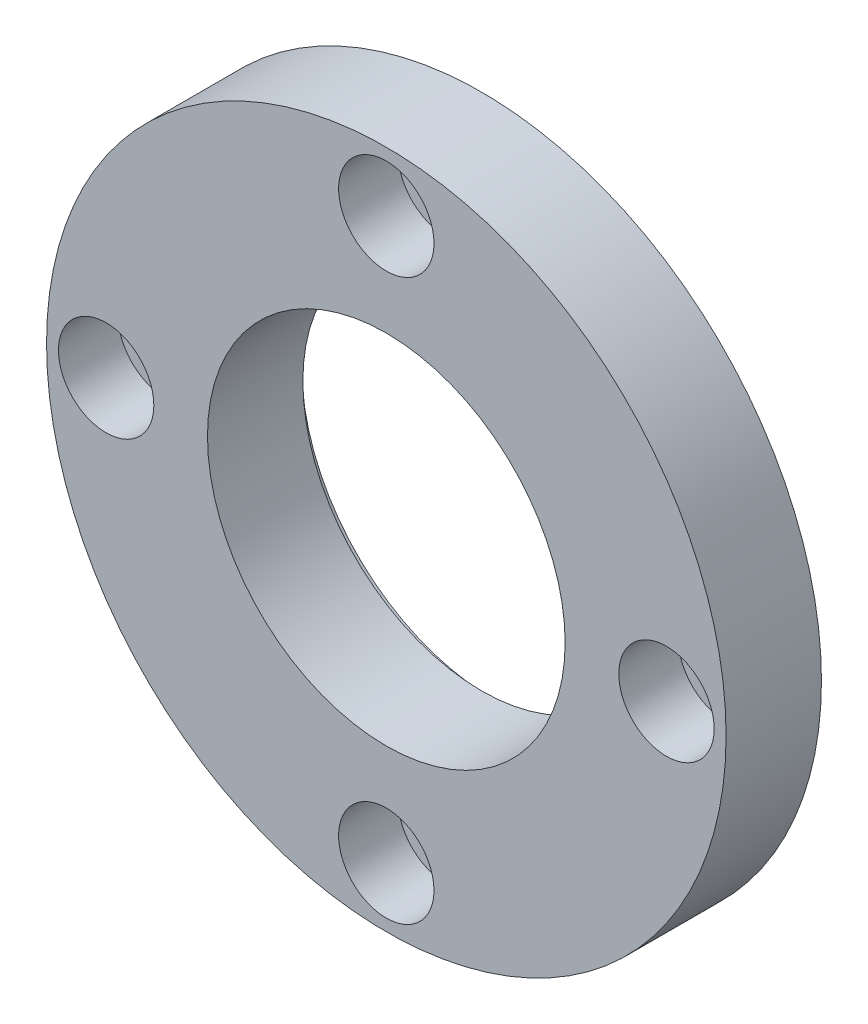
ISO-10303-21;
HEADER;
FILE_DESCRIPTION(('STEP AP214'),'2;1');
FILE_NAME('part.step','',(''),(''),'','','');
FILE_SCHEMA(('AUTOMOTIVE_DESIGN { 1 0 10303 214 1 1 1 1 }'));
ENDSEC;
DATA;
#1=APPLICATION_CONTEXT('core data for automotive mechanical design processes');
#2=APPLICATION_PROTOCOL_DEFINITION('international standard','automotive_design',2000,#1);
#3=PRODUCT_CONTEXT('',#1,'mechanical');
#4=PRODUCT('Part','Part','',(#3));
#5=PRODUCT_RELATED_PRODUCT_CATEGORY('part','',(#4));
#6=PRODUCT_DEFINITION_FORMATION('','',#4);
#7=PRODUCT_DEFINITION_CONTEXT('part definition',#1,'design');
#8=PRODUCT_DEFINITION('design','',#6,#7);
#9=PRODUCT_DEFINITION_SHAPE('','',#8);
#10=(LENGTH_UNIT() NAMED_UNIT(*) SI_UNIT(.MILLI.,.METRE.));
#11=(NAMED_UNIT(*) PLANE_ANGLE_UNIT() SI_UNIT($,.RADIAN.));
#12=(NAMED_UNIT(*) SI_UNIT($,.STERADIAN.) SOLID_ANGLE_UNIT());
#13=UNCERTAINTY_MEASURE_WITH_UNIT(LENGTH_MEASURE(1.E-05),#10,'distance_accuracy_value','');
#14=(GEOMETRIC_REPRESENTATION_CONTEXT(3) GLOBAL_UNCERTAINTY_ASSIGNED_CONTEXT((#13)) GLOBAL_UNIT_ASSIGNED_CONTEXT((#10,
#11,#12)) REPRESENTATION_CONTEXT('',''));
#15=CARTESIAN_POINT('',(0.,0.,0.));
#16=DIRECTION('',(0.,0.,1.));
#17=DIRECTION('',(1.,0.,0.));
#18=AXIS2_PLACEMENT_3D('',#15,#16,#17);
#19=CARTESIAN_POINT('',(0.,0.,0.));
#20=DIRECTION('',(0.,0.,1.));
#21=DIRECTION('',(1.,0.,0.));
#22=AXIS2_PLACEMENT_3D('',#19,#20,#21);
#23=PLANE('',#22);
#24=CARTESIAN_POINT('',(0.,-23.5,0.));
#25=DIRECTION('',(0.,0.,1.));
#26=DIRECTION('',(1.,0.,0.));
#27=AXIS2_PLACEMENT_3D('',#24,#25,#26);
#28=CIRCLE('',#27,2.25);
#29=CARTESIAN_POINT('',(2.25,-23.5,0.));
#30=VERTEX_POINT('',#29);
#31=EDGE_CURVE('E58',#30,#30,#28,.T.);
#32=ORIENTED_EDGE('',*,*,#31,.T.);
#33=EDGE_LOOP('',(#32));
#34=FACE_BOUND('',#33,.T.);
#35=CARTESIAN_POINT('',(23.5,0.,0.));
#36=DIRECTION('',(0.,0.,1.));
#37=DIRECTION('',(1.,0.,0.));
#38=AXIS2_PLACEMENT_3D('',#35,#36,#37);
#39=CIRCLE('',#38,2.25);
#40=CARTESIAN_POINT('',(25.75,0.,0.));
#41=VERTEX_POINT('',#40);
#42=EDGE_CURVE('E55',#41,#41,#39,.T.);
#43=ORIENTED_EDGE('',*,*,#42,.T.);
#44=EDGE_LOOP('',(#43));
#45=FACE_BOUND('',#44,.T.);
#46=CARTESIAN_POINT('',(0.,23.5,0.));
#47=DIRECTION('',(0.,0.,1.));
#48=DIRECTION('',(1.,0.,0.));
#49=AXIS2_PLACEMENT_3D('',#46,#47,#48);
#50=CIRCLE('',#49,2.25);
#51=CARTESIAN_POINT('',(2.25,23.5,0.));
#52=VERTEX_POINT('',#51);
#53=EDGE_CURVE('E52',#52,#52,#50,.T.);
#54=ORIENTED_EDGE('',*,*,#53,.T.);
#55=EDGE_LOOP('',(#54));
#56=FACE_BOUND('',#55,.T.);
#57=CARTESIAN_POINT('',(-23.5,0.,0.));
#58=DIRECTION('',(0.,0.,1.));
#59=DIRECTION('',(1.,0.,0.));
#60=AXIS2_PLACEMENT_3D('',#57,#58,#59);
#61=CIRCLE('',#60,2.25);
#62=CARTESIAN_POINT('',(-21.25,0.,0.));
#63=VERTEX_POINT('',#62);
#64=EDGE_CURVE('E51',#63,#63,#61,.T.);
#65=ORIENTED_EDGE('',*,*,#64,.T.);
#66=EDGE_LOOP('',(#65));
#67=FACE_BOUND('',#66,.T.);
#68=CARTESIAN_POINT('',(0.,0.,0.));
#69=DIRECTION('',(0.,0.,1.));
#70=DIRECTION('',(1.,0.,0.));
#71=AXIS2_PLACEMENT_3D('',#68,#69,#70);
#72=CIRCLE('',#71,28.5);
#73=CARTESIAN_POINT('',(28.5,0.,0.));
#74=VERTEX_POINT('',#73);
#75=EDGE_CURVE('E44',#74,#74,#72,.T.);
#76=ORIENTED_EDGE('',*,*,#75,.F.);
#77=EDGE_LOOP('',(#76));
#78=FACE_BOUND('',#77,.T.);
#79=CARTESIAN_POINT('',(0.,0.,0.));
#80=DIRECTION('',(0.,0.,1.));
#81=DIRECTION('',(1.,0.,0.));
#82=AXIS2_PLACEMENT_3D('',#79,#80,#81);
#83=CIRCLE('',#82,18.4);
#84=CARTESIAN_POINT('',(18.4,0.,0.));
#85=VERTEX_POINT('',#84);
#86=EDGE_CURVE('E10',#85,#85,#83,.F.);
#87=ORIENTED_EDGE('',*,*,#86,.F.);
#88=EDGE_LOOP('',(#87));
#89=FACE_BOUND('',#88,.T.);
#90=ADVANCED_FACE('F31',(#34,#45,#56,#67,#78,#89),#23,.F.);
#91=CARTESIAN_POINT('',(0.,0.,8.));
#92=DIRECTION('',(0.,0.,1.));
#93=DIRECTION('',(1.,0.,0.));
#94=AXIS2_PLACEMENT_3D('',#91,#92,#93);
#95=PLANE('',#94);
#96=CARTESIAN_POINT('',(23.5,0.,8.));
#97=DIRECTION('',(0.,0.,1.));
#98=DIRECTION('',(1.,0.,0.));
#99=AXIS2_PLACEMENT_3D('',#96,#97,#98);
#100=CIRCLE('',#99,4.);
#101=CARTESIAN_POINT('',(27.5,0.,8.));
#102=VERTEX_POINT('',#101);
#103=EDGE_CURVE('E73',#102,#102,#100,.T.);
#104=ORIENTED_EDGE('',*,*,#103,.F.);
#105=EDGE_LOOP('',(#104));
#106=FACE_BOUND('',#105,.T.);
#107=CARTESIAN_POINT('',(0.,-23.5,8.));
#108=DIRECTION('',(0.,0.,1.));
#109=DIRECTION('',(1.,0.,0.));
#110=AXIS2_PLACEMENT_3D('',#107,#108,#109);
#111=CIRCLE('',#110,4.);
#112=CARTESIAN_POINT('',(4.,-23.5,8.));
#113=VERTEX_POINT('',#112);
#114=EDGE_CURVE('E79',#113,#113,#111,.T.);
#115=ORIENTED_EDGE('',*,*,#114,.F.);
#116=EDGE_LOOP('',(#115));
#117=FACE_BOUND('',#116,.T.);
#118=CARTESIAN_POINT('',(-23.5,0.,8.));
#119=DIRECTION('',(0.,0.,1.));
#120=DIRECTION('',(1.,0.,0.));
#121=AXIS2_PLACEMENT_3D('',#118,#119,#120);
#122=CIRCLE('',#121,4.);
#123=CARTESIAN_POINT('',(-19.5,0.,8.));
#124=VERTEX_POINT('',#123);
#125=EDGE_CURVE('E85',#124,#124,#122,.T.);
#126=ORIENTED_EDGE('',*,*,#125,.F.);
#127=EDGE_LOOP('',(#126));
#128=FACE_BOUND('',#127,.T.);
#129=CARTESIAN_POINT('',(0.,23.5,8.));
#130=DIRECTION('',(0.,0.,1.));
#131=DIRECTION('',(1.,0.,0.));
#132=AXIS2_PLACEMENT_3D('',#129,#130,#131);
#133=CIRCLE('',#132,4.);
#134=CARTESIAN_POINT('',(4.,23.5,8.));
#135=VERTEX_POINT('',#134);
#136=EDGE_CURVE('E91',#135,#135,#133,.T.);
#137=ORIENTED_EDGE('',*,*,#136,.F.);
#138=EDGE_LOOP('',(#137));
#139=FACE_BOUND('',#138,.T.);
#140=CARTESIAN_POINT('',(0.,0.,8.));
#141=DIRECTION('',(0.,0.,1.));
#142=DIRECTION('',(1.,0.,0.));
#143=AXIS2_PLACEMENT_3D('',#140,#141,#142);
#144=CIRCLE('',#143,28.5);
#145=CARTESIAN_POINT('',(28.5,0.,8.));
#146=VERTEX_POINT('',#145);
#147=EDGE_CURVE('E39',#146,#146,#144,.T.);
#148=ORIENTED_EDGE('',*,*,#147,.T.);
#149=EDGE_LOOP('',(#148));
#150=FACE_BOUND('',#149,.T.);
#151=CARTESIAN_POINT('',(0.,0.,8.));
#152=DIRECTION('',(0.,0.,1.));
#153=DIRECTION('',(1.,0.,0.));
#154=AXIS2_PLACEMENT_3D('',#151,#152,#153);
#155=CIRCLE('',#154,15.);
#156=CARTESIAN_POINT('',(15.,0.,8.));
#157=VERTEX_POINT('',#156);
#158=EDGE_CURVE('E109',#157,#157,#155,.T.);
#159=ORIENTED_EDGE('',*,*,#158,.F.);
#160=EDGE_LOOP('',(#159));
#161=FACE_BOUND('',#160,.T.);
#162=ADVANCED_FACE('F117',(#106,#117,#128,#139,#150,#161),#95,.T.);
#163=CARTESIAN_POINT('',(0.,0.,0.));
#164=DIRECTION('',(0.,0.,-1.));
#165=DIRECTION('',(-1.,0.,0.));
#166=AXIS2_PLACEMENT_3D('',#163,#164,#165);
#167=CIRCLE('',#166,16.1);
#168=CARTESIAN_POINT('',(-16.1,0.,0.));
#169=VERTEX_POINT('',#168);
#170=EDGE_CURVE('E97',#169,#169,#167,.T.);
#171=ORIENTED_EDGE('',*,*,#170,.T.);
#172=EDGE_LOOP('',(#171));
#173=FACE_BOUND('',#172,.T.);
#174=CARTESIAN_POINT('',(0.,0.,0.));
#175=DIRECTION('',(0.,0.,1.));
#176=DIRECTION('',(1.,0.,0.));
#177=AXIS2_PLACEMENT_3D('',#174,#175,#176);
#178=CIRCLE('',#177,15.);
#179=CARTESIAN_POINT('',(15.,0.,0.));
#180=VERTEX_POINT('',#179);
#181=EDGE_CURVE('E106',#180,#180,#178,.T.);
#182=ORIENTED_EDGE('',*,*,#181,.T.);
#183=EDGE_LOOP('',(#182));
#184=FACE_BOUND('',#183,.T.);
#185=ADVANCED_FACE('F119',(#173,#184),#23,.F.);
#186=CARTESIAN_POINT('',(0.,0.,8.));
#187=DIRECTION('',(0.,0.,-1.));
#188=DIRECTION('',(-1.,0.,0.));
#189=AXIS2_PLACEMENT_3D('',#186,#187,#188);
#190=CYLINDRICAL_SURFACE('',#189,28.5);
#191=ORIENTED_EDGE('',*,*,#147,.F.);
#192=EDGE_LOOP('',(#191));
#193=FACE_BOUND('',#192,.T.);
#194=ORIENTED_EDGE('',*,*,#75,.T.);
#195=EDGE_LOOP('',(#194));
#196=FACE_BOUND('',#195,.T.);
#197=ADVANCED_FACE('F33',(#193,#196),#190,.T.);
#198=CARTESIAN_POINT('',(0.,0.,8.));
#199=DIRECTION('',(0.,0.,-1.));
#200=DIRECTION('',(-1.,0.,0.));
#201=AXIS2_PLACEMENT_3D('',#198,#199,#200);
#202=CYLINDRICAL_SURFACE('',#201,15.);
#203=ORIENTED_EDGE('',*,*,#158,.T.);
#204=EDGE_LOOP('',(#203));
#205=FACE_BOUND('',#204,.T.);
#206=ORIENTED_EDGE('',*,*,#181,.F.);
#207=EDGE_LOOP('',(#206));
#208=FACE_BOUND('',#207,.T.);
#209=ADVANCED_FACE('F131',(#205,#208),#202,.F.);
#210=CARTESIAN_POINT('',(0.,0.,-1.));
#211=DIRECTION('',(0.,0.,-1.));
#212=DIRECTION('',(-1.,0.,0.));
#213=AXIS2_PLACEMENT_3D('',#210,#211,#212);
#214=PLANE('',#213);
#215=CARTESIAN_POINT('',(0.,0.,-1.));
#216=DIRECTION('',(0.,0.,-1.));
#217=DIRECTION('',(-1.,0.,0.));
#218=AXIS2_PLACEMENT_3D('',#215,#216,#217);
#219=CIRCLE('',#218,18.4);
#220=CARTESIAN_POINT('',(-18.4,0.,-1.));
#221=VERTEX_POINT('',#220);
#222=EDGE_CURVE('E103',#221,#221,#219,.T.);
#223=ORIENTED_EDGE('',*,*,#222,.T.);
#224=EDGE_LOOP('',(#223));
#225=FACE_BOUND('',#224,.T.);
#226=CARTESIAN_POINT('',(0.,0.,-1.));
#227=DIRECTION('',(0.,0.,-1.));
#228=DIRECTION('',(-1.,0.,0.));
#229=AXIS2_PLACEMENT_3D('',#226,#227,#228);
#230=CIRCLE('',#229,16.1);
#231=CARTESIAN_POINT('',(-16.1,0.,-1.));
#232=VERTEX_POINT('',#231);
#233=EDGE_CURVE('E100',#232,#232,#230,.T.);
#234=ORIENTED_EDGE('',*,*,#233,.F.);
#235=EDGE_LOOP('',(#234));
#236=FACE_BOUND('',#235,.T.);
#237=ADVANCED_FACE('F138',(#225,#236),#214,.T.);
#238=CARTESIAN_POINT('',(0.,0.,-1.));
#239=DIRECTION('',(0.,0.,1.));
#240=DIRECTION('',(1.,0.,0.));
#241=AXIS2_PLACEMENT_3D('',#238,#239,#240);
#242=CYLINDRICAL_SURFACE('',#241,18.4);
#243=ORIENTED_EDGE('',*,*,#222,.F.);
#244=EDGE_LOOP('',(#243));
#245=FACE_BOUND('',#244,.T.);
#246=ORIENTED_EDGE('',*,*,#86,.T.);
#247=EDGE_LOOP('',(#246));
#248=FACE_BOUND('',#247,.T.);
#249=ADVANCED_FACE('F143',(#245,#248),#242,.T.);
#250=CARTESIAN_POINT('',(0.,0.,-1.));
#251=DIRECTION('',(0.,0.,1.));
#252=DIRECTION('',(1.,0.,0.));
#253=AXIS2_PLACEMENT_3D('',#250,#251,#252);
#254=CYLINDRICAL_SURFACE('',#253,16.1);
#255=ORIENTED_EDGE('',*,*,#233,.T.);
#256=EDGE_LOOP('',(#255));
#257=FACE_BOUND('',#256,.T.);
#258=ORIENTED_EDGE('',*,*,#170,.F.);
#259=EDGE_LOOP('',(#258));
#260=FACE_BOUND('',#259,.T.);
#261=ADVANCED_FACE('F148',(#257,#260),#254,.F.);
#262=CARTESIAN_POINT('',(0.,23.5,3.));
#263=DIRECTION('',(0.,0.,1.));
#264=DIRECTION('',(1.,0.,0.));
#265=AXIS2_PLACEMENT_3D('',#262,#263,#264);
#266=CYLINDRICAL_SURFACE('',#265,4.);
#267=CARTESIAN_POINT('',(0.,23.5,3.));
#268=DIRECTION('',(0.,0.,1.));
#269=DIRECTION('',(1.,0.,0.));
#270=AXIS2_PLACEMENT_3D('',#267,#268,#269);
#271=CIRCLE('',#270,4.);
#272=CARTESIAN_POINT('',(4.,23.5,3.));
#273=VERTEX_POINT('',#272);
#274=EDGE_CURVE('E94',#273,#273,#271,.T.);
#275=ORIENTED_EDGE('',*,*,#274,.F.);
#276=EDGE_LOOP('',(#275));
#277=FACE_BOUND('',#276,.T.);
#278=ORIENTED_EDGE('',*,*,#136,.T.);
#279=EDGE_LOOP('',(#278));
#280=FACE_BOUND('',#279,.T.);
#281=ADVANCED_FACE('F153',(#277,#280),#266,.F.);
#282=CARTESIAN_POINT('',(0.,23.5,3.));
#283=DIRECTION('',(0.,0.,1.));
#284=DIRECTION('',(1.,0.,0.));
#285=AXIS2_PLACEMENT_3D('',#282,#283,#284);
#286=PLANE('',#285);
#287=CARTESIAN_POINT('',(0.,23.5,3.));
#288=DIRECTION('',(0.,0.,1.));
#289=DIRECTION('',(1.,0.,0.));
#290=AXIS2_PLACEMENT_3D('',#287,#288,#289);
#291=CIRCLE('',#290,2.25);
#292=CARTESIAN_POINT('',(2.25,23.5,3.));
#293=VERTEX_POINT('',#292);
#294=EDGE_CURVE('E53',#293,#293,#291,.T.);
#295=ORIENTED_EDGE('',*,*,#294,.F.);
#296=EDGE_LOOP('',(#295));
#297=FACE_BOUND('',#296,.T.);
#298=ORIENTED_EDGE('',*,*,#274,.T.);
#299=EDGE_LOOP('',(#298));
#300=FACE_BOUND('',#299,.T.);
#301=ADVANCED_FACE('F157',(#297,#300),#286,.T.);
#302=CARTESIAN_POINT('',(-23.5,0.,3.));
#303=DIRECTION('',(0.,0.,1.));
#304=DIRECTION('',(1.,0.,0.));
#305=AXIS2_PLACEMENT_3D('',#302,#303,#304);
#306=CYLINDRICAL_SURFACE('',#305,4.);
#307=CARTESIAN_POINT('',(-23.5,0.,3.));
#308=DIRECTION('',(0.,0.,1.));
#309=DIRECTION('',(1.,0.,0.));
#310=AXIS2_PLACEMENT_3D('',#307,#308,#309);
#311=CIRCLE('',#310,4.);
#312=CARTESIAN_POINT('',(-19.5,0.,3.));
#313=VERTEX_POINT('',#312);
#314=EDGE_CURVE('E88',#313,#313,#311,.T.);
#315=ORIENTED_EDGE('',*,*,#314,.F.);
#316=EDGE_LOOP('',(#315));
#317=FACE_BOUND('',#316,.T.);
#318=ORIENTED_EDGE('',*,*,#125,.T.);
#319=EDGE_LOOP('',(#318));
#320=FACE_BOUND('',#319,.T.);
#321=ADVANCED_FACE('F161',(#317,#320),#306,.F.);
#322=CARTESIAN_POINT('',(-23.5,0.,3.));
#323=DIRECTION('',(0.,0.,1.));
#324=DIRECTION('',(1.,0.,0.));
#325=AXIS2_PLACEMENT_3D('',#322,#323,#324);
#326=PLANE('',#325);
#327=CARTESIAN_POINT('',(-23.5,0.,3.));
#328=DIRECTION('',(0.,0.,1.));
#329=DIRECTION('',(1.,0.,0.));
#330=AXIS2_PLACEMENT_3D('',#327,#328,#329);
#331=CIRCLE('',#330,2.25);
#332=CARTESIAN_POINT('',(-21.25,0.,3.));
#333=VERTEX_POINT('',#332);
#334=EDGE_CURVE('E48',#333,#333,#331,.T.);
#335=ORIENTED_EDGE('',*,*,#334,.F.);
#336=EDGE_LOOP('',(#335));
#337=FACE_BOUND('',#336,.T.);
#338=ORIENTED_EDGE('',*,*,#314,.T.);
#339=EDGE_LOOP('',(#338));
#340=FACE_BOUND('',#339,.T.);
#341=ADVANCED_FACE('F165',(#337,#340),#326,.T.);
#342=CARTESIAN_POINT('',(0.,-23.5,3.));
#343=DIRECTION('',(0.,0.,1.));
#344=DIRECTION('',(1.,0.,0.));
#345=AXIS2_PLACEMENT_3D('',#342,#343,#344);
#346=CYLINDRICAL_SURFACE('',#345,4.);
#347=CARTESIAN_POINT('',(0.,-23.5,3.));
#348=DIRECTION('',(0.,0.,1.));
#349=DIRECTION('',(1.,0.,0.));
#350=AXIS2_PLACEMENT_3D('',#347,#348,#349);
#351=CIRCLE('',#350,4.);
#352=CARTESIAN_POINT('',(4.,-23.5,3.));
#353=VERTEX_POINT('',#352);
#354=EDGE_CURVE('E82',#353,#353,#351,.T.);
#355=ORIENTED_EDGE('',*,*,#354,.F.);
#356=EDGE_LOOP('',(#355));
#357=FACE_BOUND('',#356,.T.);
#358=ORIENTED_EDGE('',*,*,#114,.T.);
#359=EDGE_LOOP('',(#358));
#360=FACE_BOUND('',#359,.T.);
#361=ADVANCED_FACE('F169',(#357,#360),#346,.F.);
#362=CARTESIAN_POINT('',(0.,-23.5,3.));
#363=DIRECTION('',(0.,0.,1.));
#364=DIRECTION('',(1.,0.,0.));
#365=AXIS2_PLACEMENT_3D('',#362,#363,#364);
#366=PLANE('',#365);
#367=CARTESIAN_POINT('',(0.,-23.5,3.));
#368=DIRECTION('',(0.,0.,1.));
#369=DIRECTION('',(1.,0.,0.));
#370=AXIS2_PLACEMENT_3D('',#367,#368,#369);
#371=CIRCLE('',#370,2.25);
#372=CARTESIAN_POINT('',(2.25,-23.5,3.));
#373=VERTEX_POINT('',#372);
#374=EDGE_CURVE('E35',#373,#373,#371,.T.);
#375=ORIENTED_EDGE('',*,*,#374,.F.);
#376=EDGE_LOOP('',(#375));
#377=FACE_BOUND('',#376,.T.);
#378=ORIENTED_EDGE('',*,*,#354,.T.);
#379=EDGE_LOOP('',(#378));
#380=FACE_BOUND('',#379,.T.);
#381=ADVANCED_FACE('F173',(#377,#380),#366,.T.);
#382=CARTESIAN_POINT('',(23.5,0.,3.));
#383=DIRECTION('',(0.,0.,1.));
#384=DIRECTION('',(1.,0.,0.));
#385=AXIS2_PLACEMENT_3D('',#382,#383,#384);
#386=CYLINDRICAL_SURFACE('',#385,4.);
#387=CARTESIAN_POINT('',(23.5,0.,3.));
#388=DIRECTION('',(0.,0.,1.));
#389=DIRECTION('',(1.,0.,0.));
#390=AXIS2_PLACEMENT_3D('',#387,#388,#389);
#391=CIRCLE('',#390,4.);
#392=CARTESIAN_POINT('',(27.5,0.,3.));
#393=VERTEX_POINT('',#392);
#394=EDGE_CURVE('E76',#393,#393,#391,.T.);
#395=ORIENTED_EDGE('',*,*,#394,.F.);
#396=EDGE_LOOP('',(#395));
#397=FACE_BOUND('',#396,.T.);
#398=ORIENTED_EDGE('',*,*,#103,.T.);
#399=EDGE_LOOP('',(#398));
#400=FACE_BOUND('',#399,.T.);
#401=ADVANCED_FACE('F177',(#397,#400),#386,.F.);
#402=CARTESIAN_POINT('',(23.5,0.,3.));
#403=DIRECTION('',(0.,0.,1.));
#404=DIRECTION('',(1.,0.,0.));
#405=AXIS2_PLACEMENT_3D('',#402,#403,#404);
#406=PLANE('',#405);
#407=CARTESIAN_POINT('',(23.5,0.,3.));
#408=DIRECTION('',(0.,0.,1.));
#409=DIRECTION('',(1.,0.,0.));
#410=AXIS2_PLACEMENT_3D('',#407,#408,#409);
#411=CIRCLE('',#410,2.25);
#412=CARTESIAN_POINT('',(25.75,0.,3.));
#413=VERTEX_POINT('',#412);
#414=EDGE_CURVE('E56',#413,#413,#411,.T.);
#415=ORIENTED_EDGE('',*,*,#414,.F.);
#416=EDGE_LOOP('',(#415));
#417=FACE_BOUND('',#416,.T.);
#418=ORIENTED_EDGE('',*,*,#394,.T.);
#419=EDGE_LOOP('',(#418));
#420=FACE_BOUND('',#419,.T.);
#421=ADVANCED_FACE('F181',(#417,#420),#406,.T.);
#422=CARTESIAN_POINT('',(-23.5,0.,-1.));
#423=DIRECTION('',(0.,0.,1.));
#424=DIRECTION('',(1.,0.,0.));
#425=AXIS2_PLACEMENT_3D('',#422,#423,#424);
#426=CYLINDRICAL_SURFACE('',#425,2.25);
#427=ORIENTED_EDGE('',*,*,#334,.T.);
#428=EDGE_LOOP('',(#427));
#429=FACE_BOUND('',#428,.T.);
#430=ORIENTED_EDGE('',*,*,#64,.F.);
#431=EDGE_LOOP('',(#430));
#432=FACE_BOUND('',#431,.T.);
#433=ADVANCED_FACE('F185',(#429,#432),#426,.F.);
#434=CARTESIAN_POINT('',(0.,23.5,-1.));
#435=DIRECTION('',(0.,0.,1.));
#436=DIRECTION('',(1.,0.,0.));
#437=AXIS2_PLACEMENT_3D('',#434,#435,#436);
#438=CYLINDRICAL_SURFACE('',#437,2.25);
#439=ORIENTED_EDGE('',*,*,#294,.T.);
#440=EDGE_LOOP('',(#439));
#441=FACE_BOUND('',#440,.T.);
#442=ORIENTED_EDGE('',*,*,#53,.F.);
#443=EDGE_LOOP('',(#442));
#444=FACE_BOUND('',#443,.T.);
#445=ADVANCED_FACE('F189',(#441,#444),#438,.F.);
#446=CARTESIAN_POINT('',(23.5,0.,-1.));
#447=DIRECTION('',(0.,0.,1.));
#448=DIRECTION('',(1.,0.,0.));
#449=AXIS2_PLACEMENT_3D('',#446,#447,#448);
#450=CYLINDRICAL_SURFACE('',#449,2.25);
#451=ORIENTED_EDGE('',*,*,#414,.T.);
#452=EDGE_LOOP('',(#451));
#453=FACE_BOUND('',#452,.T.);
#454=ORIENTED_EDGE('',*,*,#42,.F.);
#455=EDGE_LOOP('',(#454));
#456=FACE_BOUND('',#455,.T.);
#457=ADVANCED_FACE('F193',(#453,#456),#450,.F.);
#458=CARTESIAN_POINT('',(0.,-23.5,-1.));
#459=DIRECTION('',(0.,0.,1.));
#460=DIRECTION('',(1.,0.,0.));
#461=AXIS2_PLACEMENT_3D('',#458,#459,#460);
#462=CYLINDRICAL_SURFACE('',#461,2.25);
#463=ORIENTED_EDGE('',*,*,#374,.T.);
#464=EDGE_LOOP('',(#463));
#465=FACE_BOUND('',#464,.T.);
#466=ORIENTED_EDGE('',*,*,#31,.F.);
#467=EDGE_LOOP('',(#466));
#468=FACE_BOUND('',#467,.T.);
#469=ADVANCED_FACE('F197',(#465,#468),#462,.F.);
#470=CLOSED_SHELL('',(#90,#162,#185,#197,#209,#237,#249,#261,#281,#301,#321,#341,#361,#381,#401,
#421,#433,#445,#457,#469));
#471=MANIFOLD_SOLID_BREP('B2',#470);
#472=ADVANCED_BREP_SHAPE_REPRESENTATION('',(#18,#471),#14);
#473=SHAPE_DEFINITION_REPRESENTATION(#9,#472);
ENDSEC;
END-ISO-10303-21;
